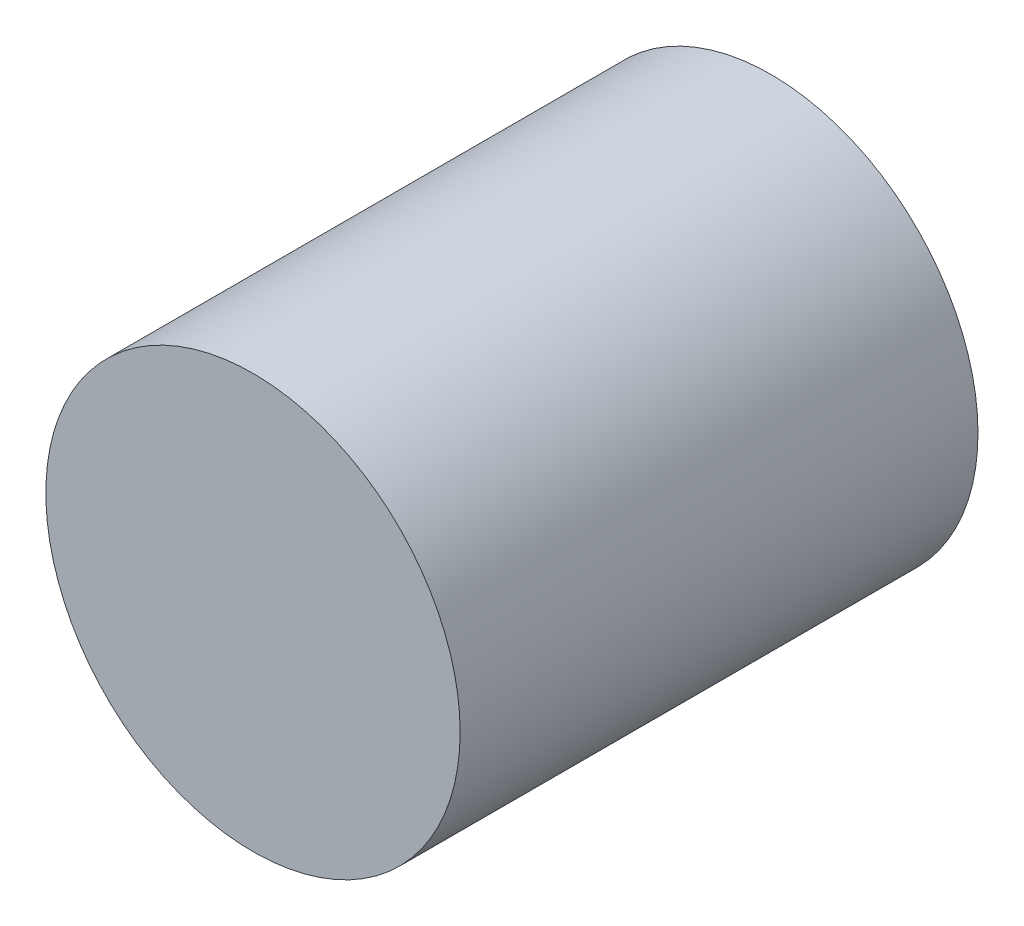
ISO-10303-21;
HEADER;
FILE_DESCRIPTION(('STEP AP214'),'2;1');
FILE_NAME('part.step','',(''),(''),'','','');
FILE_SCHEMA(('AUTOMOTIVE_DESIGN { 1 0 10303 214 1 1 1 1 }'));
ENDSEC;
DATA;
#1=APPLICATION_CONTEXT('core data for automotive mechanical design processes');
#2=APPLICATION_PROTOCOL_DEFINITION('international standard','automotive_design',2000,#1);
#3=PRODUCT_CONTEXT('',#1,'mechanical');
#4=PRODUCT('Part','Part','',(#3));
#5=PRODUCT_RELATED_PRODUCT_CATEGORY('part','',(#4));
#6=PRODUCT_DEFINITION_FORMATION('','',#4);
#7=PRODUCT_DEFINITION_CONTEXT('part definition',#1,'design');
#8=PRODUCT_DEFINITION('design','',#6,#7);
#9=PRODUCT_DEFINITION_SHAPE('','',#8);
#10=(LENGTH_UNIT() NAMED_UNIT(*) SI_UNIT(.MILLI.,.METRE.));
#11=(NAMED_UNIT(*) PLANE_ANGLE_UNIT() SI_UNIT($,.RADIAN.));
#12=(NAMED_UNIT(*) SI_UNIT($,.STERADIAN.) SOLID_ANGLE_UNIT());
#13=UNCERTAINTY_MEASURE_WITH_UNIT(LENGTH_MEASURE(1.E-05),#10,'distance_accuracy_value','');
#14=(GEOMETRIC_REPRESENTATION_CONTEXT(3) GLOBAL_UNCERTAINTY_ASSIGNED_CONTEXT((#13)) GLOBAL_UNIT_ASSIGNED_CONTEXT((#10,
#11,#12)) REPRESENTATION_CONTEXT('',''));
#15=CARTESIAN_POINT('',(0.,0.,0.));
#16=DIRECTION('',(0.,0.,1.));
#17=DIRECTION('',(1.,0.,0.));
#18=AXIS2_PLACEMENT_3D('',#15,#16,#17);
#19=CARTESIAN_POINT('',(0.,0.,2.5));
#20=DIRECTION('',(0.,0.,-1.));
#21=DIRECTION('',(-1.,0.,0.));
#22=AXIS2_PLACEMENT_3D('',#19,#20,#21);
#23=CYLINDRICAL_SURFACE('',#22,2.);
#24=CARTESIAN_POINT('',(0.,0.,2.5));
#25=DIRECTION('',(0.,0.,1.));
#26=DIRECTION('',(1.,0.,0.));
#27=AXIS2_PLACEMENT_3D('',#24,#25,#26);
#28=CIRCLE('',#27,2.);
#29=CARTESIAN_POINT('',(2.,0.,2.5));
#30=VERTEX_POINT('',#29);
#31=EDGE_CURVE('E10',#30,#30,#28,.T.);
#32=ORIENTED_EDGE('',*,*,#31,.F.);
#33=EDGE_LOOP('',(#32));
#34=FACE_BOUND('',#33,.T.);
#35=CARTESIAN_POINT('',(0.,0.,-2.5));
#36=DIRECTION('',(0.,0.,1.));
#37=DIRECTION('',(1.,0.,0.));
#38=AXIS2_PLACEMENT_3D('',#35,#36,#37);
#39=CIRCLE('',#38,2.);
#40=CARTESIAN_POINT('',(2.,0.,-2.5));
#41=VERTEX_POINT('',#40);
#42=EDGE_CURVE('E36',#41,#41,#39,.T.);
#43=ORIENTED_EDGE('',*,*,#42,.T.);
#44=EDGE_LOOP('',(#43));
#45=FACE_BOUND('',#44,.T.);
#46=ADVANCED_FACE('F33',(#34,#45),#23,.T.);
#47=CARTESIAN_POINT('',(0.,0.,2.5));
#48=DIRECTION('',(0.,0.,1.));
#49=DIRECTION('',(1.,0.,0.));
#50=AXIS2_PLACEMENT_3D('',#47,#48,#49);
#51=PLANE('',#50);
#52=ORIENTED_EDGE('',*,*,#31,.T.);
#53=EDGE_LOOP('',(#52));
#54=FACE_BOUND('',#53,.T.);
#55=ADVANCED_FACE('F48',(#54),#51,.T.);
#56=CARTESIAN_POINT('',(0.,0.,-2.5));
#57=DIRECTION('',(0.,0.,1.));
#58=DIRECTION('',(1.,0.,0.));
#59=AXIS2_PLACEMENT_3D('',#56,#57,#58);
#60=PLANE('',#59);
#61=ORIENTED_EDGE('',*,*,#42,.F.);
#62=EDGE_LOOP('',(#61));
#63=FACE_BOUND('',#62,.T.);
#64=ADVANCED_FACE('F46',(#63),#60,.F.);
#65=CLOSED_SHELL('',(#46,#55,#64));
#66=MANIFOLD_SOLID_BREP('B2',#65);
#67=ADVANCED_BREP_SHAPE_REPRESENTATION('',(#18,#66),#14);
#68=SHAPE_DEFINITION_REPRESENTATION(#9,#67);
ENDSEC;
END-ISO-10303-21;
